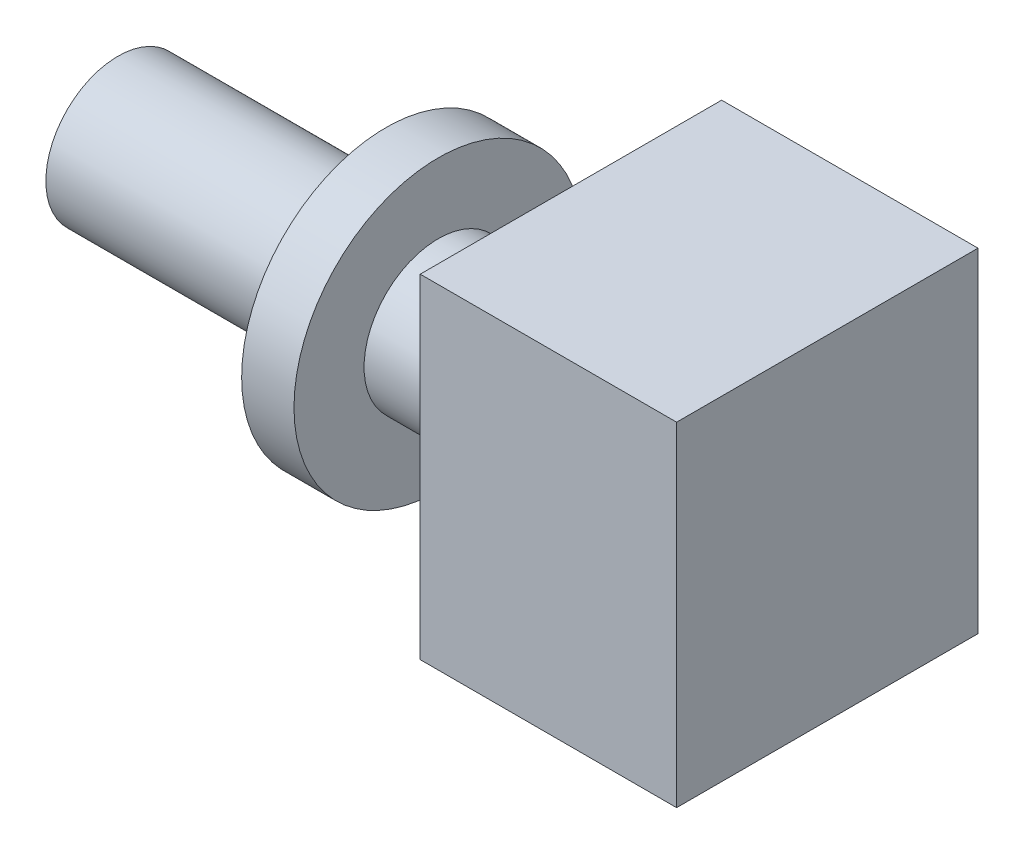
ISO-10303-21;
HEADER;
FILE_DESCRIPTION(('STEP AP214'),'2;1');
FILE_NAME('part.step','',(''),(''),'','','');
FILE_SCHEMA(('AUTOMOTIVE_DESIGN { 1 0 10303 214 1 1 1 1 }'));
ENDSEC;
DATA;
#1=APPLICATION_CONTEXT('core data for automotive mechanical design processes');
#2=APPLICATION_PROTOCOL_DEFINITION('international standard','automotive_design',2000,#1);
#3=PRODUCT_CONTEXT('',#1,'mechanical');
#4=PRODUCT('Part','Part','',(#3));
#5=PRODUCT_RELATED_PRODUCT_CATEGORY('part','',(#4));
#6=PRODUCT_DEFINITION_FORMATION('','',#4);
#7=PRODUCT_DEFINITION_CONTEXT('part definition',#1,'design');
#8=PRODUCT_DEFINITION('design','',#6,#7);
#9=PRODUCT_DEFINITION_SHAPE('','',#8);
#10=(LENGTH_UNIT() NAMED_UNIT(*) SI_UNIT(.MILLI.,.METRE.));
#11=(NAMED_UNIT(*) PLANE_ANGLE_UNIT() SI_UNIT($,.RADIAN.));
#12=(NAMED_UNIT(*) SI_UNIT($,.STERADIAN.) SOLID_ANGLE_UNIT());
#13=UNCERTAINTY_MEASURE_WITH_UNIT(LENGTH_MEASURE(1.E-05),#10,'distance_accuracy_value','');
#14=(GEOMETRIC_REPRESENTATION_CONTEXT(3) GLOBAL_UNCERTAINTY_ASSIGNED_CONTEXT((#13)) GLOBAL_UNIT_ASSIGNED_CONTEXT((#10,
#11,#12)) REPRESENTATION_CONTEXT('',''));
#15=CARTESIAN_POINT('',(0.,0.,0.));
#16=DIRECTION('',(0.,0.,1.));
#17=DIRECTION('',(1.,0.,0.));
#18=AXIS2_PLACEMENT_3D('',#15,#16,#17);
#19=CARTESIAN_POINT('',(-65.,0.,0.));
#20=DIRECTION('',(1.,0.,0.));
#21=DIRECTION('',(0.,0.,-1.));
#22=AXIS2_PLACEMENT_3D('',#19,#20,#21);
#23=CYLINDRICAL_SURFACE('',#22,17.5);
#24=CARTESIAN_POINT('',(-65.,0.,0.));
#25=DIRECTION('',(1.,0.,0.));
#26=DIRECTION('',(0.,0.,-1.));
#27=AXIS2_PLACEMENT_3D('',#24,#25,#26);
#28=CIRCLE('',#27,17.5);
#29=CARTESIAN_POINT('',(-65.,0.,-17.5));
#30=VERTEX_POINT('',#29);
#31=EDGE_CURVE('E48',#30,#30,#28,.T.);
#32=ORIENTED_EDGE('',*,*,#31,.T.);
#33=EDGE_LOOP('',(#32));
#34=FACE_BOUND('',#33,.T.);
#35=CARTESIAN_POINT('',(0.,0.,0.));
#36=DIRECTION('',(1.,0.,0.));
#37=DIRECTION('',(0.,0.,-1.));
#38=AXIS2_PLACEMENT_3D('',#35,#36,#37);
#39=CIRCLE('',#38,17.5);
#40=CARTESIAN_POINT('',(0.,0.,-17.5));
#41=VERTEX_POINT('',#40);
#42=EDGE_CURVE('E42',#41,#41,#39,.T.);
#43=ORIENTED_EDGE('',*,*,#42,.F.);
#44=EDGE_LOOP('',(#43));
#45=FACE_BOUND('',#44,.T.);
#46=ADVANCED_FACE('F39',(#34,#45),#23,.T.);
#47=CARTESIAN_POINT('',(-65.,0.,0.));
#48=DIRECTION('',(1.,0.,0.));
#49=DIRECTION('',(0.,0.,-1.));
#50=AXIS2_PLACEMENT_3D('',#47,#48,#49);
#51=PLANE('',#50);
#52=ORIENTED_EDGE('',*,*,#31,.F.);
#53=EDGE_LOOP('',(#52));
#54=FACE_BOUND('',#53,.T.);
#55=ADVANCED_FACE('F135',(#54),#51,.F.);
#56=CARTESIAN_POINT('',(12.7,0.,0.));
#57=DIRECTION('',(-1.,0.,0.));
#58=DIRECTION('',(0.,0.,1.));
#59=AXIS2_PLACEMENT_3D('',#56,#57,#58);
#60=CYLINDRICAL_SURFACE('',#59,35.);
#61=CARTESIAN_POINT('',(12.7,0.,0.));
#62=DIRECTION('',(1.,0.,0.));
#63=DIRECTION('',(0.,0.,-1.));
#64=AXIS2_PLACEMENT_3D('',#61,#62,#63);
#65=CIRCLE('',#64,35.);
#66=CARTESIAN_POINT('',(12.7,0.,-35.));
#67=VERTEX_POINT('',#66);
#68=EDGE_CURVE('E121',#67,#67,#65,.T.);
#69=ORIENTED_EDGE('',*,*,#68,.F.);
#70=EDGE_LOOP('',(#69));
#71=FACE_BOUND('',#70,.T.);
#72=CARTESIAN_POINT('',(0.,0.,0.));
#73=DIRECTION('',(1.,0.,0.));
#74=DIRECTION('',(0.,0.,-1.));
#75=AXIS2_PLACEMENT_3D('',#72,#73,#74);
#76=CIRCLE('',#75,35.);
#77=CARTESIAN_POINT('',(0.,0.,-35.));
#78=VERTEX_POINT('',#77);
#79=EDGE_CURVE('E119',#78,#78,#76,.T.);
#80=ORIENTED_EDGE('',*,*,#79,.T.);
#81=EDGE_LOOP('',(#80));
#82=FACE_BOUND('',#81,.T.);
#83=ADVANCED_FACE('F139',(#71,#82),#60,.T.);
#84=CARTESIAN_POINT('',(12.7,0.,0.));
#85=DIRECTION('',(1.,0.,0.));
#86=DIRECTION('',(0.,0.,-1.));
#87=AXIS2_PLACEMENT_3D('',#84,#85,#86);
#88=PLANE('',#87);
#89=CARTESIAN_POINT('',(12.7,0.,0.));
#90=DIRECTION('',(1.,0.,0.));
#91=DIRECTION('',(0.,0.,-1.));
#92=AXIS2_PLACEMENT_3D('',#89,#90,#91);
#93=CIRCLE('',#92,18.);
#94=CARTESIAN_POINT('',(12.7,0.,-18.));
#95=VERTEX_POINT('',#94);
#96=EDGE_CURVE('E11',#95,#95,#93,.T.);
#97=ORIENTED_EDGE('',*,*,#96,.F.);
#98=EDGE_LOOP('',(#97));
#99=FACE_BOUND('',#98,.T.);
#100=ORIENTED_EDGE('',*,*,#68,.T.);
#101=EDGE_LOOP('',(#100));
#102=FACE_BOUND('',#101,.T.);
#103=ADVANCED_FACE('F144',(#99,#102),#88,.T.);
#104=CARTESIAN_POINT('',(0.,0.,0.));
#105=DIRECTION('',(1.,0.,0.));
#106=DIRECTION('',(0.,0.,-1.));
#107=AXIS2_PLACEMENT_3D('',#104,#105,#106);
#108=PLANE('',#107);
#109=ORIENTED_EDGE('',*,*,#42,.T.);
#110=EDGE_LOOP('',(#109));
#111=FACE_BOUND('',#110,.T.);
#112=ORIENTED_EDGE('',*,*,#79,.F.);
#113=EDGE_LOOP('',(#112));
#114=FACE_BOUND('',#113,.T.);
#115=ADVANCED_FACE('F131',(#111,#114),#108,.F.);
#116=CARTESIAN_POINT('',(44.3,0.,0.));
#117=DIRECTION('',(-1.,0.,0.));
#118=DIRECTION('',(0.,0.,1.));
#119=AXIS2_PLACEMENT_3D('',#116,#117,#118);
#120=CYLINDRICAL_SURFACE('',#119,18.);
#121=CARTESIAN_POINT('',(44.3,0.,0.));
#122=DIRECTION('',(1.,0.,0.));
#123=DIRECTION('',(0.,0.,-1.));
#124=AXIS2_PLACEMENT_3D('',#121,#122,#123);
#125=CIRCLE('',#124,18.);
#126=CARTESIAN_POINT('',(44.3,0.,-18.));
#127=VERTEX_POINT('',#126);
#128=EDGE_CURVE('E117',#127,#127,#125,.T.);
#129=ORIENTED_EDGE('',*,*,#128,.F.);
#130=EDGE_LOOP('',(#129));
#131=FACE_BOUND('',#130,.T.);
#132=ORIENTED_EDGE('',*,*,#96,.T.);
#133=EDGE_LOOP('',(#132));
#134=FACE_BOUND('',#133,.T.);
#135=ADVANCED_FACE('F150',(#131,#134),#120,.T.);
#136=CARTESIAN_POINT('',(106.5,44.3291387344518,35.9728800115924));
#137=DIRECTION('',(0.,0.,-1.));
#138=DIRECTION('',(0.,1.,0.));
#139=AXIS2_PLACEMENT_3D('',#136,#137,#138);
#140=PLANE('',#139);
#141=DIRECTION('',(0.,-1.,0.));
#142=VECTOR('',#141,1.);
#143=CARTESIAN_POINT('',(44.3,44.3291387344518,35.9728800115924));
#144=LINE('',#143,#142);
#145=CARTESIAN_POINT('',(44.3,44.3291387344518,35.9728800115924));
#146=VERTEX_POINT('',#145);
#147=CARTESIAN_POINT('',(44.3,-36.6708612655482,35.9728800115924));
#148=VERTEX_POINT('',#147);
#149=EDGE_CURVE('E108',#146,#148,#144,.T.);
#150=ORIENTED_EDGE('',*,*,#149,.T.);
#151=DIRECTION('',(-1.,0.,0.));
#152=VECTOR('',#151,1.);
#153=CARTESIAN_POINT('',(106.5,-36.6708612655482,35.9728800115924));
#154=LINE('',#153,#152);
#155=CARTESIAN_POINT('',(106.5,-36.6708612655482,35.9728800115924));
#156=VERTEX_POINT('',#155);
#157=EDGE_CURVE('E99',#156,#148,#154,.T.);
#158=ORIENTED_EDGE('',*,*,#157,.F.);
#159=DIRECTION('',(0.,-1.,0.));
#160=VECTOR('',#159,1.);
#161=CARTESIAN_POINT('',(106.5,44.3291387344518,35.9728800115924));
#162=LINE('',#161,#160);
#163=CARTESIAN_POINT('',(106.5,44.3291387344518,35.9728800115924));
#164=VERTEX_POINT('',#163);
#165=EDGE_CURVE('E93',#164,#156,#162,.T.);
#166=ORIENTED_EDGE('',*,*,#165,.F.);
#167=DIRECTION('',(-1.,0.,0.));
#168=VECTOR('',#167,1.);
#169=CARTESIAN_POINT('',(106.5,44.3291387344518,35.9728800115924));
#170=LINE('',#169,#168);
#171=EDGE_CURVE('E104',#164,#146,#170,.T.);
#172=ORIENTED_EDGE('',*,*,#171,.T.);
#173=EDGE_LOOP('',(#150,#158,#166,#172));
#174=FACE_BOUND('',#173,.T.);
#175=ADVANCED_FACE('F156',(#174),#140,.F.);
#176=CARTESIAN_POINT('',(106.5,-36.6708612655482,35.9728800115924));
#177=DIRECTION('',(0.,1.,0.));
#178=DIRECTION('',(0.,0.,1.));
#179=AXIS2_PLACEMENT_3D('',#176,#177,#178);
#180=PLANE('',#179);
#181=DIRECTION('',(0.,0.,-1.));
#182=VECTOR('',#181,1.);
#183=CARTESIAN_POINT('',(44.3,-36.6708612655482,35.9728800115924));
#184=LINE('',#183,#182);
#185=CARTESIAN_POINT('',(44.3,-36.6708612655482,-37.1540790567491));
#186=VERTEX_POINT('',#185);
#187=EDGE_CURVE('E98',#148,#186,#184,.T.);
#188=ORIENTED_EDGE('',*,*,#187,.T.);
#189=DIRECTION('',(-1.,0.,0.));
#190=VECTOR('',#189,1.);
#191=CARTESIAN_POINT('',(106.5,-36.6708612655482,-37.1540790567491));
#192=LINE('',#191,#190);
#193=CARTESIAN_POINT('',(106.5,-36.6708612655482,-37.1540790567491));
#194=VERTEX_POINT('',#193);
#195=EDGE_CURVE('E96',#194,#186,#192,.T.);
#196=ORIENTED_EDGE('',*,*,#195,.F.);
#197=DIRECTION('',(0.,0.,-1.));
#198=VECTOR('',#197,1.);
#199=CARTESIAN_POINT('',(106.5,-36.6708612655482,35.9728800115924));
#200=LINE('',#199,#198);
#201=EDGE_CURVE('E88',#156,#194,#200,.T.);
#202=ORIENTED_EDGE('',*,*,#201,.F.);
#203=ORIENTED_EDGE('',*,*,#157,.T.);
#204=EDGE_LOOP('',(#188,#196,#202,#203));
#205=FACE_BOUND('',#204,.T.);
#206=ADVANCED_FACE('F97',(#205),#180,.F.);
#207=CARTESIAN_POINT('',(106.5,-36.6708612655482,-37.1540790567491));
#208=DIRECTION('',(0.,0.,1.));
#209=DIRECTION('',(1.,0.,0.));
#210=AXIS2_PLACEMENT_3D('',#207,#208,#209);
#211=PLANE('',#210);
#212=DIRECTION('',(0.,1.,0.));
#213=VECTOR('',#212,1.);
#214=CARTESIAN_POINT('',(44.3,-36.6708612655482,-37.1540790567491));
#215=LINE('',#214,#213);
#216=CARTESIAN_POINT('',(44.3,44.3291387344518,-37.1540790567491));
#217=VERTEX_POINT('',#216);
#218=EDGE_CURVE('E74',#186,#217,#215,.T.);
#219=ORIENTED_EDGE('',*,*,#218,.T.);
#220=DIRECTION('',(-1.,0.,0.));
#221=VECTOR('',#220,1.);
#222=CARTESIAN_POINT('',(106.5,44.3291387344518,-37.1540790567491));
#223=LINE('',#222,#221);
#224=CARTESIAN_POINT('',(106.5,44.3291387344518,-37.1540790567491));
#225=VERTEX_POINT('',#224);
#226=EDGE_CURVE('E100',#225,#217,#223,.T.);
#227=ORIENTED_EDGE('',*,*,#226,.F.);
#228=DIRECTION('',(0.,1.,0.));
#229=VECTOR('',#228,1.);
#230=CARTESIAN_POINT('',(106.5,-36.6708612655482,-37.1540790567491));
#231=LINE('',#230,#229);
#232=EDGE_CURVE('E91',#194,#225,#231,.T.);
#233=ORIENTED_EDGE('',*,*,#232,.F.);
#234=ORIENTED_EDGE('',*,*,#195,.T.);
#235=EDGE_LOOP('',(#219,#227,#233,#234));
#236=FACE_BOUND('',#235,.T.);
#237=ADVANCED_FACE('F102',(#236),#211,.F.);
#238=CARTESIAN_POINT('',(106.5,44.3291387344518,-37.1540790567491));
#239=DIRECTION('',(0.,-1.,0.));
#240=DIRECTION('',(0.,0.,-1.));
#241=AXIS2_PLACEMENT_3D('',#238,#239,#240);
#242=PLANE('',#241);
#243=DIRECTION('',(0.,0.,1.));
#244=VECTOR('',#243,1.);
#245=CARTESIAN_POINT('',(44.3,44.3291387344518,-37.1540790567491));
#246=LINE('',#245,#244);
#247=EDGE_CURVE('E80',#217,#146,#246,.T.);
#248=ORIENTED_EDGE('',*,*,#247,.T.);
#249=ORIENTED_EDGE('',*,*,#171,.F.);
#250=DIRECTION('',(0.,0.,1.));
#251=VECTOR('',#250,1.);
#252=CARTESIAN_POINT('',(106.5,44.3291387344518,-37.1540790567491));
#253=LINE('',#252,#251);
#254=EDGE_CURVE('E57',#225,#164,#253,.T.);
#255=ORIENTED_EDGE('',*,*,#254,.F.);
#256=ORIENTED_EDGE('',*,*,#226,.T.);
#257=EDGE_LOOP('',(#248,#249,#255,#256));
#258=FACE_BOUND('',#257,.T.);
#259=ADVANCED_FACE('F165',(#258),#242,.F.);
#260=CARTESIAN_POINT('',(106.5,0.,0.));
#261=DIRECTION('',(1.,0.,0.));
#262=DIRECTION('',(0.,0.,-1.));
#263=AXIS2_PLACEMENT_3D('',#260,#261,#262);
#264=PLANE('',#263);
#265=ORIENTED_EDGE('',*,*,#165,.T.);
#266=ORIENTED_EDGE('',*,*,#201,.T.);
#267=ORIENTED_EDGE('',*,*,#232,.T.);
#268=ORIENTED_EDGE('',*,*,#254,.T.);
#269=EDGE_LOOP('',(#265,#266,#267,#268));
#270=FACE_BOUND('',#269,.T.);
#271=ADVANCED_FACE('F89',(#270),#264,.T.);
#272=CARTESIAN_POINT('',(44.3,0.,0.));
#273=DIRECTION('',(1.,0.,0.));
#274=DIRECTION('',(0.,0.,-1.));
#275=AXIS2_PLACEMENT_3D('',#272,#273,#274);
#276=PLANE('',#275);
#277=ORIENTED_EDGE('',*,*,#128,.T.);
#278=EDGE_LOOP('',(#277));
#279=FACE_BOUND('',#278,.T.);
#280=ORIENTED_EDGE('',*,*,#149,.F.);
#281=ORIENTED_EDGE('',*,*,#247,.F.);
#282=ORIENTED_EDGE('',*,*,#218,.F.);
#283=ORIENTED_EDGE('',*,*,#187,.F.);
#284=EDGE_LOOP('',(#280,#281,#282,#283));
#285=FACE_BOUND('',#284,.T.);
#286=ADVANCED_FACE('F168',(#279,#285),#276,.F.);
#287=CLOSED_SHELL('',(#46,#55,#83,#103,#115,#135,#175,#206,#237,#259,#271,#286));
#288=MANIFOLD_SOLID_BREP('B2',#287);
#289=ADVANCED_BREP_SHAPE_REPRESENTATION('',(#18,#288),#14);
#290=SHAPE_DEFINITION_REPRESENTATION(#9,#289);
ENDSEC;
END-ISO-10303-21;
